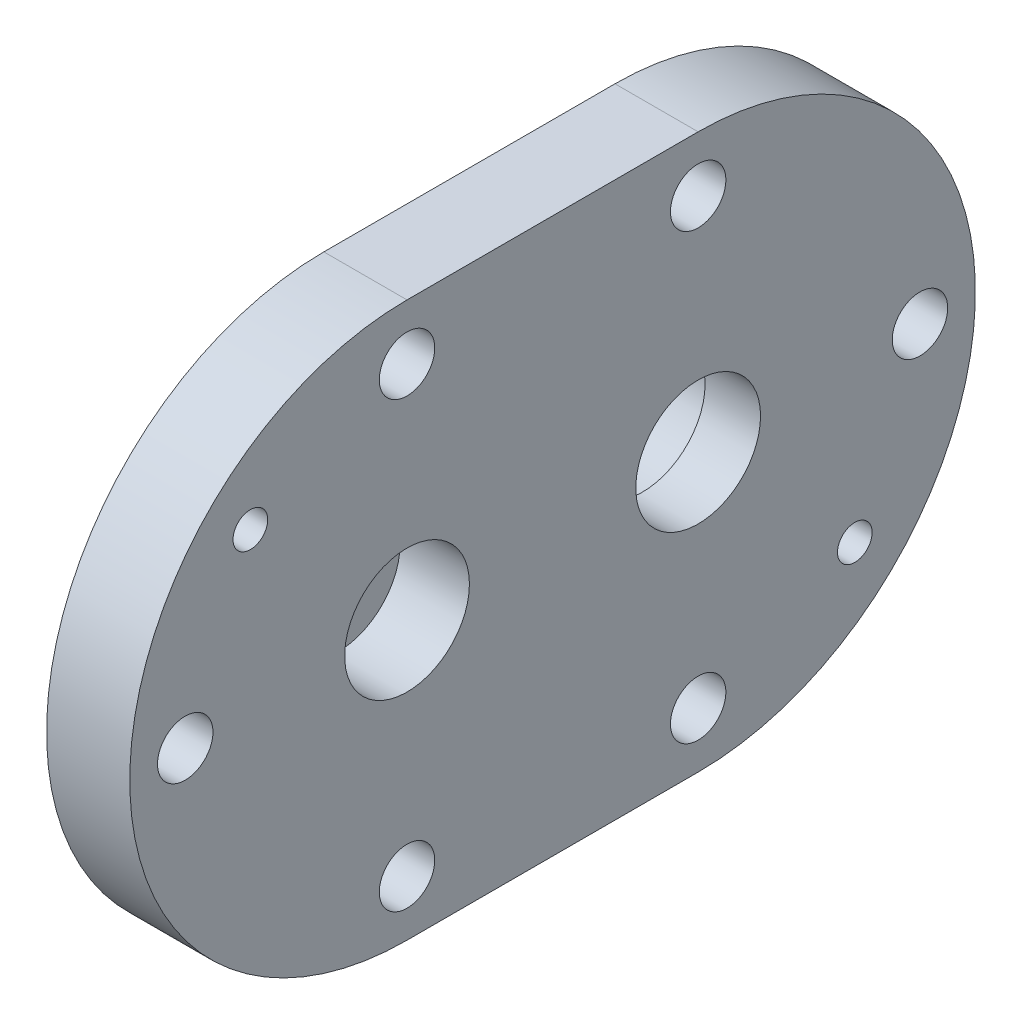
ISO-10303-21;
HEADER;
FILE_DESCRIPTION(('STEP AP214'),'2;1');
FILE_NAME('part.step','',(''),(''),'','','');
FILE_SCHEMA(('AUTOMOTIVE_DESIGN { 1 0 10303 214 1 1 1 1 }'));
ENDSEC;
DATA;
#1=APPLICATION_CONTEXT('core data for automotive mechanical design processes');
#2=APPLICATION_PROTOCOL_DEFINITION('international standard','automotive_design',2000,#1);
#3=PRODUCT_CONTEXT('',#1,'mechanical');
#4=PRODUCT('Part','Part','',(#3));
#5=PRODUCT_RELATED_PRODUCT_CATEGORY('part','',(#4));
#6=PRODUCT_DEFINITION_FORMATION('','',#4);
#7=PRODUCT_DEFINITION_CONTEXT('part definition',#1,'design');
#8=PRODUCT_DEFINITION('design','',#6,#7);
#9=PRODUCT_DEFINITION_SHAPE('','',#8);
#10=(LENGTH_UNIT() NAMED_UNIT(*) SI_UNIT(.MILLI.,.METRE.));
#11=(NAMED_UNIT(*) PLANE_ANGLE_UNIT() SI_UNIT($,.RADIAN.));
#12=(NAMED_UNIT(*) SI_UNIT($,.STERADIAN.) SOLID_ANGLE_UNIT());
#13=UNCERTAINTY_MEASURE_WITH_UNIT(LENGTH_MEASURE(1.E-05),#10,'distance_accuracy_value','');
#14=(GEOMETRIC_REPRESENTATION_CONTEXT(3) GLOBAL_UNCERTAINTY_ASSIGNED_CONTEXT((#13)) GLOBAL_UNIT_ASSIGNED_CONTEXT((#10,
#11,#12)) REPRESENTATION_CONTEXT('',''));
#15=CARTESIAN_POINT('',(0.,0.,0.));
#16=DIRECTION('',(0.,0.,1.));
#17=DIRECTION('',(1.,0.,0.));
#18=AXIS2_PLACEMENT_3D('',#15,#16,#17);
#19=CARTESIAN_POINT('',(-30.,0.,104.));
#20=DIRECTION('',(-1.,0.,0.));
#21=DIRECTION('',(0.,0.,1.));
#22=AXIS2_PLACEMENT_3D('',#19,#20,#21);
#23=CYLINDRICAL_SURFACE('',#22,40.);
#24=CARTESIAN_POINT('',(-42.,0.,104.));
#25=DIRECTION('',(1.,0.,0.));
#26=DIRECTION('',(0.,0.,-1.));
#27=AXIS2_PLACEMENT_3D('',#24,#25,#26);
#28=CIRCLE('',#27,40.);
#29=CARTESIAN_POINT('',(-42.,40.,104.));
#30=VERTEX_POINT('',#29);
#31=CARTESIAN_POINT('',(-42.,-40.,104.));
#32=VERTEX_POINT('',#31);
#33=EDGE_CURVE('E107',#30,#32,#28,.T.);
#34=ORIENTED_EDGE('',*,*,#33,.T.);
#35=DIRECTION('',(-1.,0.,0.));
#36=VECTOR('',#35,1.);
#37=CARTESIAN_POINT('',(-30.,-40.,104.));
#38=LINE('',#37,#36);
#39=CARTESIAN_POINT('',(-30.,-40.,104.));
#40=VERTEX_POINT('',#39);
#41=EDGE_CURVE('E48',#40,#32,#38,.T.);
#42=ORIENTED_EDGE('',*,*,#41,.F.);
#43=CARTESIAN_POINT('',(-30.,0.,104.));
#44=DIRECTION('',(1.,0.,0.));
#45=DIRECTION('',(0.,0.,-1.));
#46=AXIS2_PLACEMENT_3D('',#43,#44,#45);
#47=CIRCLE('',#46,40.);
#48=CARTESIAN_POINT('',(-30.,40.,104.));
#49=VERTEX_POINT('',#48);
#50=EDGE_CURVE('E93',#49,#40,#47,.T.);
#51=ORIENTED_EDGE('',*,*,#50,.F.);
#52=DIRECTION('',(-1.,0.,0.));
#53=VECTOR('',#52,1.);
#54=CARTESIAN_POINT('',(-30.,40.,104.));
#55=LINE('',#54,#53);
#56=EDGE_CURVE('E103',#49,#30,#55,.T.);
#57=ORIENTED_EDGE('',*,*,#56,.T.);
#58=EDGE_LOOP('',(#34,#42,#51,#57));
#59=FACE_BOUND('',#58,.T.);
#60=ADVANCED_FACE('F39',(#59),#23,.T.);
#61=CARTESIAN_POINT('',(-30.,-40.,104.));
#62=DIRECTION('',(0.,1.,0.));
#63=DIRECTION('',(0.,0.,1.));
#64=AXIS2_PLACEMENT_3D('',#61,#62,#63);
#65=PLANE('',#64);
#66=DIRECTION('',(0.,0.,-1.));
#67=VECTOR('',#66,1.);
#68=CARTESIAN_POINT('',(-42.,-40.,104.));
#69=LINE('',#68,#67);
#70=CARTESIAN_POINT('',(-42.,-40.,62.));
#71=VERTEX_POINT('',#70);
#72=EDGE_CURVE('E98',#32,#71,#69,.T.);
#73=ORIENTED_EDGE('',*,*,#72,.T.);
#74=DIRECTION('',(-1.,0.,0.));
#75=VECTOR('',#74,1.);
#76=CARTESIAN_POINT('',(-30.,-40.,62.));
#77=LINE('',#76,#75);
#78=CARTESIAN_POINT('',(-30.,-40.,62.));
#79=VERTEX_POINT('',#78);
#80=EDGE_CURVE('E96',#79,#71,#77,.T.);
#81=ORIENTED_EDGE('',*,*,#80,.F.);
#82=DIRECTION('',(0.,0.,-1.));
#83=VECTOR('',#82,1.);
#84=CARTESIAN_POINT('',(-30.,-40.,104.));
#85=LINE('',#84,#83);
#86=EDGE_CURVE('E88',#40,#79,#85,.T.);
#87=ORIENTED_EDGE('',*,*,#86,.F.);
#88=ORIENTED_EDGE('',*,*,#41,.T.);
#89=EDGE_LOOP('',(#73,#81,#87,#88));
#90=FACE_BOUND('',#89,.T.);
#91=ADVANCED_FACE('F97',(#90),#65,.F.);
#92=CARTESIAN_POINT('',(-30.,0.,62.));
#93=DIRECTION('',(-1.,0.,0.));
#94=DIRECTION('',(0.,0.,1.));
#95=AXIS2_PLACEMENT_3D('',#92,#93,#94);
#96=CYLINDRICAL_SURFACE('',#95,40.);
#97=CARTESIAN_POINT('',(-42.,0.,62.));
#98=DIRECTION('',(1.,0.,0.));
#99=DIRECTION('',(0.,0.,-1.));
#100=AXIS2_PLACEMENT_3D('',#97,#98,#99);
#101=CIRCLE('',#100,40.);
#102=CARTESIAN_POINT('',(-42.,40.,62.));
#103=VERTEX_POINT('',#102);
#104=EDGE_CURVE('E74',#71,#103,#101,.T.);
#105=ORIENTED_EDGE('',*,*,#104,.T.);
#106=DIRECTION('',(-1.,0.,0.));
#107=VECTOR('',#106,1.);
#108=CARTESIAN_POINT('',(-30.,40.,62.));
#109=LINE('',#108,#107);
#110=CARTESIAN_POINT('',(-30.,40.,62.));
#111=VERTEX_POINT('',#110);
#112=EDGE_CURVE('E99',#111,#103,#109,.T.);
#113=ORIENTED_EDGE('',*,*,#112,.F.);
#114=CARTESIAN_POINT('',(-30.,0.,62.));
#115=DIRECTION('',(1.,0.,0.));
#116=DIRECTION('',(0.,0.,-1.));
#117=AXIS2_PLACEMENT_3D('',#114,#115,#116);
#118=CIRCLE('',#117,40.);
#119=EDGE_CURVE('E91',#79,#111,#118,.T.);
#120=ORIENTED_EDGE('',*,*,#119,.F.);
#121=ORIENTED_EDGE('',*,*,#80,.T.);
#122=EDGE_LOOP('',(#105,#113,#120,#121));
#123=FACE_BOUND('',#122,.T.);
#124=ADVANCED_FACE('F101',(#123),#96,.T.);
#125=CARTESIAN_POINT('',(-30.,40.,62.));
#126=DIRECTION('',(0.,-1.,0.));
#127=DIRECTION('',(0.,0.,-1.));
#128=AXIS2_PLACEMENT_3D('',#125,#126,#127);
#129=PLANE('',#128);
#130=DIRECTION('',(0.,0.,1.));
#131=VECTOR('',#130,1.);
#132=CARTESIAN_POINT('',(-42.,40.,62.));
#133=LINE('',#132,#131);
#134=EDGE_CURVE('E80',#103,#30,#133,.T.);
#135=ORIENTED_EDGE('',*,*,#134,.T.);
#136=ORIENTED_EDGE('',*,*,#56,.F.);
#137=DIRECTION('',(0.,0.,1.));
#138=VECTOR('',#137,1.);
#139=CARTESIAN_POINT('',(-30.,40.,62.));
#140=LINE('',#139,#138);
#141=EDGE_CURVE('E57',#111,#49,#140,.T.);
#142=ORIENTED_EDGE('',*,*,#141,.F.);
#143=ORIENTED_EDGE('',*,*,#112,.T.);
#144=EDGE_LOOP('',(#135,#136,#142,#143));
#145=FACE_BOUND('',#144,.T.);
#146=ADVANCED_FACE('F222',(#145),#129,.F.);
#147=CARTESIAN_POINT('',(-30.,0.,104.));
#148=DIRECTION('',(1.,0.,0.));
#149=DIRECTION('',(0.,0.,-1.));
#150=AXIS2_PLACEMENT_3D('',#147,#148,#149);
#151=PLANE('',#150);
#152=CARTESIAN_POINT('',(-30.,-22.6,39.4));
#153=DIRECTION('',(1.,0.,0.));
#154=DIRECTION('',(0.,0.,-1.));
#155=AXIS2_PLACEMENT_3D('',#152,#153,#154);
#156=CIRCLE('',#155,2.5);
#157=CARTESIAN_POINT('',(-30.,-22.6,36.9));
#158=VERTEX_POINT('',#157);
#159=EDGE_CURVE('E148',#158,#158,#156,.F.);
#160=ORIENTED_EDGE('',*,*,#159,.T.);
#161=EDGE_LOOP('',(#160));
#162=FACE_BOUND('',#161,.T.);
#163=CARTESIAN_POINT('',(-30.,22.6,126.6));
#164=DIRECTION('',(1.,0.,0.));
#165=DIRECTION('',(0.,0.,-1.));
#166=AXIS2_PLACEMENT_3D('',#163,#164,#165);
#167=CIRCLE('',#166,2.5);
#168=CARTESIAN_POINT('',(-30.,22.6,124.1));
#169=VERTEX_POINT('',#168);
#170=EDGE_CURVE('E145',#169,#169,#167,.F.);
#171=ORIENTED_EDGE('',*,*,#170,.T.);
#172=EDGE_LOOP('',(#171));
#173=FACE_BOUND('',#172,.T.);
#174=CARTESIAN_POINT('',(-30.,0.,30.));
#175=DIRECTION('',(1.,0.,0.));
#176=DIRECTION('',(0.,0.,-1.));
#177=AXIS2_PLACEMENT_3D('',#174,#175,#176);
#178=CIRCLE('',#177,4.);
#179=CARTESIAN_POINT('',(-30.,0.,26.));
#180=VERTEX_POINT('',#179);
#181=EDGE_CURVE('E142',#180,#180,#178,.F.);
#182=ORIENTED_EDGE('',*,*,#181,.T.);
#183=EDGE_LOOP('',(#182));
#184=FACE_BOUND('',#183,.T.);
#185=CARTESIAN_POINT('',(-30.,0.,136.));
#186=DIRECTION('',(1.,0.,0.));
#187=DIRECTION('',(0.,0.,-1.));
#188=AXIS2_PLACEMENT_3D('',#185,#186,#187);
#189=CIRCLE('',#188,4.);
#190=CARTESIAN_POINT('',(-30.,0.,132.));
#191=VERTEX_POINT('',#190);
#192=EDGE_CURVE('E138',#191,#191,#189,.F.);
#193=ORIENTED_EDGE('',*,*,#192,.T.);
#194=EDGE_LOOP('',(#193));
#195=FACE_BOUND('',#194,.T.);
#196=CARTESIAN_POINT('',(-30.,-32.,62.));
#197=DIRECTION('',(1.,0.,0.));
#198=DIRECTION('',(0.,0.,-1.));
#199=AXIS2_PLACEMENT_3D('',#196,#197,#198);
#200=CIRCLE('',#199,4.);
#201=CARTESIAN_POINT('',(-30.,-32.,58.));
#202=VERTEX_POINT('',#201);
#203=EDGE_CURVE('E134',#202,#202,#200,.F.);
#204=ORIENTED_EDGE('',*,*,#203,.T.);
#205=EDGE_LOOP('',(#204));
#206=FACE_BOUND('',#205,.T.);
#207=CARTESIAN_POINT('',(-30.,32.,62.));
#208=DIRECTION('',(1.,0.,0.));
#209=DIRECTION('',(0.,0.,-1.));
#210=AXIS2_PLACEMENT_3D('',#207,#208,#209);
#211=CIRCLE('',#210,4.);
#212=CARTESIAN_POINT('',(-30.,32.,58.));
#213=VERTEX_POINT('',#212);
#214=EDGE_CURVE('E130',#213,#213,#211,.F.);
#215=ORIENTED_EDGE('',*,*,#214,.T.);
#216=EDGE_LOOP('',(#215));
#217=FACE_BOUND('',#216,.T.);
#218=CARTESIAN_POINT('',(-30.,-32.,104.));
#219=DIRECTION('',(1.,0.,0.));
#220=DIRECTION('',(0.,0.,-1.));
#221=AXIS2_PLACEMENT_3D('',#218,#219,#220);
#222=CIRCLE('',#221,4.);
#223=CARTESIAN_POINT('',(-30.,-32.,100.));
#224=VERTEX_POINT('',#223);
#225=EDGE_CURVE('E126',#224,#224,#222,.F.);
#226=ORIENTED_EDGE('',*,*,#225,.T.);
#227=EDGE_LOOP('',(#226));
#228=FACE_BOUND('',#227,.T.);
#229=CARTESIAN_POINT('',(-30.,32.,104.));
#230=DIRECTION('',(1.,0.,0.));
#231=DIRECTION('',(0.,0.,-1.));
#232=AXIS2_PLACEMENT_3D('',#229,#230,#231);
#233=CIRCLE('',#232,4.);
#234=CARTESIAN_POINT('',(-30.,32.,100.));
#235=VERTEX_POINT('',#234);
#236=EDGE_CURVE('E125',#235,#235,#233,.F.);
#237=ORIENTED_EDGE('',*,*,#236,.T.);
#238=EDGE_LOOP('',(#237));
#239=FACE_BOUND('',#238,.T.);
#240=CARTESIAN_POINT('',(-30.,0.,62.));
#241=DIRECTION('',(1.,0.,0.));
#242=DIRECTION('',(0.,0.,-1.));
#243=AXIS2_PLACEMENT_3D('',#240,#241,#242);
#244=CIRCLE('',#243,9.);
#245=CARTESIAN_POINT('',(-30.,0.,53.));
#246=VERTEX_POINT('',#245);
#247=EDGE_CURVE('E120',#246,#246,#244,.T.);
#248=ORIENTED_EDGE('',*,*,#247,.F.);
#249=EDGE_LOOP('',(#248));
#250=FACE_BOUND('',#249,.T.);
#251=CARTESIAN_POINT('',(-30.,0.,104.));
#252=DIRECTION('',(1.,0.,0.));
#253=DIRECTION('',(0.,0.,-1.));
#254=AXIS2_PLACEMENT_3D('',#251,#252,#253);
#255=CIRCLE('',#254,8.99999999999999);
#256=CARTESIAN_POINT('',(-30.,0.,95.));
#257=VERTEX_POINT('',#256);
#258=EDGE_CURVE('E178',#257,#257,#255,.T.);
#259=ORIENTED_EDGE('',*,*,#258,.F.);
#260=EDGE_LOOP('',(#259));
#261=FACE_BOUND('',#260,.T.);
#262=ORIENTED_EDGE('',*,*,#50,.T.);
#263=ORIENTED_EDGE('',*,*,#86,.T.);
#264=ORIENTED_EDGE('',*,*,#119,.T.);
#265=ORIENTED_EDGE('',*,*,#141,.T.);
#266=EDGE_LOOP('',(#262,#263,#264,#265));
#267=FACE_BOUND('',#266,.T.);
#268=ADVANCED_FACE('F89',(#162,#173,#184,#195,#206,#217,#228,#239,#250,#261,#267),#151,.T.);
#269=CARTESIAN_POINT('',(-42.,0.,104.));
#270=DIRECTION('',(1.,0.,0.));
#271=DIRECTION('',(0.,0.,-1.));
#272=AXIS2_PLACEMENT_3D('',#269,#270,#271);
#273=PLANE('',#272);
#274=CARTESIAN_POINT('',(-42.,-22.6,39.4));
#275=DIRECTION('',(1.,0.,0.));
#276=DIRECTION('',(0.,0.,-1.));
#277=AXIS2_PLACEMENT_3D('',#274,#275,#276);
#278=CIRCLE('',#277,2.5);
#279=CARTESIAN_POINT('',(-42.,-22.6,36.9));
#280=VERTEX_POINT('',#279);
#281=EDGE_CURVE('E42',#280,#280,#278,.F.);
#282=ORIENTED_EDGE('',*,*,#281,.F.);
#283=EDGE_LOOP('',(#282));
#284=FACE_BOUND('',#283,.T.);
#285=CARTESIAN_POINT('',(-42.,22.6,126.6));
#286=DIRECTION('',(1.,0.,0.));
#287=DIRECTION('',(0.,0.,-1.));
#288=AXIS2_PLACEMENT_3D('',#285,#286,#287);
#289=CIRCLE('',#288,2.5);
#290=CARTESIAN_POINT('',(-42.,22.6,124.1));
#291=VERTEX_POINT('',#290);
#292=EDGE_CURVE('E146',#291,#291,#289,.F.);
#293=ORIENTED_EDGE('',*,*,#292,.F.);
#294=EDGE_LOOP('',(#293));
#295=FACE_BOUND('',#294,.T.);
#296=CARTESIAN_POINT('',(-42.,0.,30.));
#297=DIRECTION('',(1.,0.,0.));
#298=DIRECTION('',(0.,0.,-1.));
#299=AXIS2_PLACEMENT_3D('',#296,#297,#298);
#300=CIRCLE('',#299,4.);
#301=CARTESIAN_POINT('',(-42.,0.,26.));
#302=VERTEX_POINT('',#301);
#303=EDGE_CURVE('E143',#302,#302,#300,.F.);
#304=ORIENTED_EDGE('',*,*,#303,.F.);
#305=EDGE_LOOP('',(#304));
#306=FACE_BOUND('',#305,.T.);
#307=CARTESIAN_POINT('',(-42.,0.,136.));
#308=DIRECTION('',(1.,0.,0.));
#309=DIRECTION('',(0.,0.,-1.));
#310=AXIS2_PLACEMENT_3D('',#307,#308,#309);
#311=CIRCLE('',#310,4.);
#312=CARTESIAN_POINT('',(-42.,0.,132.));
#313=VERTEX_POINT('',#312);
#314=EDGE_CURVE('E139',#313,#313,#311,.F.);
#315=ORIENTED_EDGE('',*,*,#314,.F.);
#316=EDGE_LOOP('',(#315));
#317=FACE_BOUND('',#316,.T.);
#318=CARTESIAN_POINT('',(-42.,-32.,62.));
#319=DIRECTION('',(1.,0.,0.));
#320=DIRECTION('',(0.,0.,-1.));
#321=AXIS2_PLACEMENT_3D('',#318,#319,#320);
#322=CIRCLE('',#321,4.);
#323=CARTESIAN_POINT('',(-42.,-32.,58.));
#324=VERTEX_POINT('',#323);
#325=EDGE_CURVE('E135',#324,#324,#322,.F.);
#326=ORIENTED_EDGE('',*,*,#325,.F.);
#327=EDGE_LOOP('',(#326));
#328=FACE_BOUND('',#327,.T.);
#329=CARTESIAN_POINT('',(-42.,32.,62.));
#330=DIRECTION('',(1.,0.,0.));
#331=DIRECTION('',(0.,0.,-1.));
#332=AXIS2_PLACEMENT_3D('',#329,#330,#331);
#333=CIRCLE('',#332,4.);
#334=CARTESIAN_POINT('',(-42.,32.,58.));
#335=VERTEX_POINT('',#334);
#336=EDGE_CURVE('E131',#335,#335,#333,.F.);
#337=ORIENTED_EDGE('',*,*,#336,.F.);
#338=EDGE_LOOP('',(#337));
#339=FACE_BOUND('',#338,.T.);
#340=CARTESIAN_POINT('',(-42.,-32.,104.));
#341=DIRECTION('',(1.,0.,0.));
#342=DIRECTION('',(0.,0.,-1.));
#343=AXIS2_PLACEMENT_3D('',#340,#341,#342);
#344=CIRCLE('',#343,4.);
#345=CARTESIAN_POINT('',(-42.,-32.,100.));
#346=VERTEX_POINT('',#345);
#347=EDGE_CURVE('E127',#346,#346,#344,.F.);
#348=ORIENTED_EDGE('',*,*,#347,.F.);
#349=EDGE_LOOP('',(#348));
#350=FACE_BOUND('',#349,.T.);
#351=CARTESIAN_POINT('',(-42.,32.,104.));
#352=DIRECTION('',(1.,0.,0.));
#353=DIRECTION('',(0.,0.,-1.));
#354=AXIS2_PLACEMENT_3D('',#351,#352,#353);
#355=CIRCLE('',#354,4.);
#356=CARTESIAN_POINT('',(-42.,32.,100.));
#357=VERTEX_POINT('',#356);
#358=EDGE_CURVE('E122',#357,#357,#355,.F.);
#359=ORIENTED_EDGE('',*,*,#358,.F.);
#360=EDGE_LOOP('',(#359));
#361=FACE_BOUND('',#360,.T.);
#362=CARTESIAN_POINT('',(-42.,0.,62.));
#363=DIRECTION('',(1.,0.,0.));
#364=DIRECTION('',(0.,0.,-1.));
#365=AXIS2_PLACEMENT_3D('',#362,#363,#364);
#366=CIRCLE('',#365,16.);
#367=CARTESIAN_POINT('',(-42.,0.,46.));
#368=VERTEX_POINT('',#367);
#369=EDGE_CURVE('E11',#368,#368,#366,.F.);
#370=ORIENTED_EDGE('',*,*,#369,.F.);
#371=EDGE_LOOP('',(#370));
#372=FACE_BOUND('',#371,.T.);
#373=CARTESIAN_POINT('',(-42.,0.,104.));
#374=DIRECTION('',(1.,0.,0.));
#375=DIRECTION('',(0.,0.,-1.));
#376=AXIS2_PLACEMENT_3D('',#373,#374,#375);
#377=CIRCLE('',#376,16.);
#378=CARTESIAN_POINT('',(-42.,0.,88.));
#379=VERTEX_POINT('',#378);
#380=EDGE_CURVE('E110',#379,#379,#377,.T.);
#381=ORIENTED_EDGE('',*,*,#380,.T.);
#382=EDGE_LOOP('',(#381));
#383=FACE_BOUND('',#382,.T.);
#384=ORIENTED_EDGE('',*,*,#33,.F.);
#385=ORIENTED_EDGE('',*,*,#134,.F.);
#386=ORIENTED_EDGE('',*,*,#104,.F.);
#387=ORIENTED_EDGE('',*,*,#72,.F.);
#388=EDGE_LOOP('',(#384,#385,#386,#387));
#389=FACE_BOUND('',#388,.T.);
#390=ADVANCED_FACE('F206',(#284,#295,#306,#317,#328,#339,#350,#361,#372,#383,#389),#273,.F.);
#391=CARTESIAN_POINT('',(-42.,0.,104.));
#392=DIRECTION('',(-1.,0.,0.));
#393=DIRECTION('',(0.,0.,1.));
#394=AXIS2_PLACEMENT_3D('',#391,#392,#393);
#395=CYLINDRICAL_SURFACE('',#394,16.);
#396=ORIENTED_EDGE('',*,*,#380,.F.);
#397=EDGE_LOOP('',(#396));
#398=FACE_BOUND('',#397,.T.);
#399=CARTESIAN_POINT('',(-52.,0.,104.));
#400=DIRECTION('',(1.,0.,0.));
#401=DIRECTION('',(0.,0.,-1.));
#402=AXIS2_PLACEMENT_3D('',#399,#400,#401);
#403=CIRCLE('',#402,16.);
#404=CARTESIAN_POINT('',(-52.,0.,88.));
#405=VERTEX_POINT('',#404);
#406=EDGE_CURVE('E187',#405,#405,#403,.T.);
#407=ORIENTED_EDGE('',*,*,#406,.T.);
#408=EDGE_LOOP('',(#407));
#409=FACE_BOUND('',#408,.T.);
#410=ADVANCED_FACE('F193',(#398,#409),#395,.T.);
#411=CARTESIAN_POINT('',(-52.,0.,104.));
#412=DIRECTION('',(1.,0.,0.));
#413=DIRECTION('',(0.,0.,-1.));
#414=AXIS2_PLACEMENT_3D('',#411,#412,#413);
#415=PLANE('',#414);
#416=ORIENTED_EDGE('',*,*,#406,.F.);
#417=EDGE_LOOP('',(#416));
#418=FACE_BOUND('',#417,.T.);
#419=ADVANCED_FACE('F195',(#418),#415,.F.);
#420=CARTESIAN_POINT('',(-42.,0.,62.));
#421=DIRECTION('',(-1.,0.,0.));
#422=DIRECTION('',(0.,0.,1.));
#423=AXIS2_PLACEMENT_3D('',#420,#421,#422);
#424=CYLINDRICAL_SURFACE('',#423,16.);
#425=ORIENTED_EDGE('',*,*,#369,.T.);
#426=EDGE_LOOP('',(#425));
#427=FACE_BOUND('',#426,.T.);
#428=CARTESIAN_POINT('',(-64.,0.,62.));
#429=DIRECTION('',(1.,0.,0.));
#430=DIRECTION('',(0.,0.,-1.));
#431=AXIS2_PLACEMENT_3D('',#428,#429,#430);
#432=CIRCLE('',#431,16.);
#433=CARTESIAN_POINT('',(-64.,0.,46.));
#434=VERTEX_POINT('',#433);
#435=EDGE_CURVE('E182',#434,#434,#432,.T.);
#436=ORIENTED_EDGE('',*,*,#435,.T.);
#437=EDGE_LOOP('',(#436));
#438=FACE_BOUND('',#437,.T.);
#439=ADVANCED_FACE('F197',(#427,#438),#424,.T.);
#440=CARTESIAN_POINT('',(-64.,0.,62.));
#441=DIRECTION('',(1.,0.,0.));
#442=DIRECTION('',(0.,0.,-1.));
#443=AXIS2_PLACEMENT_3D('',#440,#441,#442);
#444=PLANE('',#443);
#445=CARTESIAN_POINT('',(-64.,0.,62.));
#446=DIRECTION('',(1.,0.,0.));
#447=DIRECTION('',(0.,0.,-1.));
#448=AXIS2_PLACEMENT_3D('',#445,#446,#447);
#449=CIRCLE('',#448,10.);
#450=CARTESIAN_POINT('',(-64.,0.,72.));
#451=VERTEX_POINT('',#450);
#452=EDGE_CURVE('E171',#451,#451,#449,.T.);
#453=ORIENTED_EDGE('',*,*,#452,.T.);
#454=EDGE_LOOP('',(#453));
#455=FACE_BOUND('',#454,.T.);
#456=ORIENTED_EDGE('',*,*,#435,.F.);
#457=EDGE_LOOP('',(#456));
#458=FACE_BOUND('',#457,.T.);
#459=ADVANCED_FACE('F203',(#455,#458),#444,.F.);
#460=CARTESIAN_POINT('',(-40.,0.,104.));
#461=DIRECTION('',(1.,0.,0.));
#462=DIRECTION('',(0.,0.,-1.));
#463=AXIS2_PLACEMENT_3D('',#460,#461,#462);
#464=CYLINDRICAL_SURFACE('',#463,8.99999999999999);
#465=CARTESIAN_POINT('',(-40.,0.,104.));
#466=DIRECTION('',(1.,0.,0.));
#467=DIRECTION('',(0.,0.,-1.));
#468=AXIS2_PLACEMENT_3D('',#465,#466,#467);
#469=CIRCLE('',#468,8.99999999999999);
#470=CARTESIAN_POINT('',(-40.,0.,95.));
#471=VERTEX_POINT('',#470);
#472=EDGE_CURVE('E179',#471,#471,#469,.T.);
#473=ORIENTED_EDGE('',*,*,#472,.F.);
#474=EDGE_LOOP('',(#473));
#475=FACE_BOUND('',#474,.T.);
#476=ORIENTED_EDGE('',*,*,#258,.T.);
#477=EDGE_LOOP('',(#476));
#478=FACE_BOUND('',#477,.T.);
#479=ADVANCED_FACE('F351',(#475,#478),#464,.F.);
#480=CARTESIAN_POINT('',(-40.,0.,104.));
#481=DIRECTION('',(1.,0.,0.));
#482=DIRECTION('',(0.,0.,-1.));
#483=AXIS2_PLACEMENT_3D('',#480,#481,#482);
#484=PLANE('',#483);
#485=ORIENTED_EDGE('',*,*,#472,.T.);
#486=EDGE_LOOP('',(#485));
#487=FACE_BOUND('',#486,.T.);
#488=ADVANCED_FACE('F342',(#487),#484,.T.);
#489=CARTESIAN_POINT('',(-40.,0.,62.));
#490=DIRECTION('',(1.,0.,0.));
#491=DIRECTION('',(0.,0.,-1.));
#492=AXIS2_PLACEMENT_3D('',#489,#490,#491);
#493=CYLINDRICAL_SURFACE('',#492,9.);
#494=CARTESIAN_POINT('',(-38.,0.,62.));
#495=DIRECTION('',(1.,0.,0.));
#496=DIRECTION('',(0.,0.,-1.));
#497=AXIS2_PLACEMENT_3D('',#494,#495,#496);
#498=CIRCLE('',#497,9.);
#499=CARTESIAN_POINT('',(-38.,0.,53.));
#500=VERTEX_POINT('',#499);
#501=EDGE_CURVE('E117',#500,#500,#498,.F.);
#502=ORIENTED_EDGE('',*,*,#501,.T.);
#503=EDGE_LOOP('',(#502));
#504=FACE_BOUND('',#503,.T.);
#505=ORIENTED_EDGE('',*,*,#247,.T.);
#506=EDGE_LOOP('',(#505));
#507=FACE_BOUND('',#506,.T.);
#508=ADVANCED_FACE('F334',(#504,#507),#493,.F.);
#509=CARTESIAN_POINT('',(-38.,0.,62.));
#510=DIRECTION('',(1.,0.,0.));
#511=DIRECTION('',(0.,0.,-1.));
#512=AXIS2_PLACEMENT_3D('',#509,#510,#511);
#513=PLANE('',#512);
#514=CARTESIAN_POINT('',(-38.,0.,62.));
#515=DIRECTION('',(1.,0.,0.));
#516=DIRECTION('',(0.,0.,-1.));
#517=AXIS2_PLACEMENT_3D('',#514,#515,#516);
#518=CIRCLE('',#517,10.);
#519=CARTESIAN_POINT('',(-38.,0.,72.));
#520=VERTEX_POINT('',#519);
#521=EDGE_CURVE('E121',#520,#520,#518,.T.);
#522=ORIENTED_EDGE('',*,*,#521,.F.);
#523=EDGE_LOOP('',(#522));
#524=FACE_BOUND('',#523,.T.);
#525=ORIENTED_EDGE('',*,*,#501,.F.);
#526=EDGE_LOOP('',(#525));
#527=FACE_BOUND('',#526,.T.);
#528=ADVANCED_FACE('F326',(#524,#527),#513,.F.);
#529=CARTESIAN_POINT('',(-38.,0.,62.));
#530=DIRECTION('',(-1.,0.,0.));
#531=DIRECTION('',(0.,0.,1.));
#532=AXIS2_PLACEMENT_3D('',#529,#530,#531);
#533=CYLINDRICAL_SURFACE('',#532,10.);
#534=CARTESIAN_POINT('',(-38.,0.,72.));
#535=CARTESIAN_POINT('',(-38.2708333333333,0.,72.));
#536=CARTESIAN_POINT('',(-38.5416666666667,0.,72.));
#537=CARTESIAN_POINT('',(-39.0833333333333,0.,72.));
#538=CARTESIAN_POINT('',(-39.3541666666667,0.,72.));
#539=CARTESIAN_POINT('',(-39.8958333333333,0.,72.));
#540=CARTESIAN_POINT('',(-40.1666666666667,0.,72.));
#541=CARTESIAN_POINT('',(-40.7083333333333,0.,72.));
#542=CARTESIAN_POINT('',(-40.9791666666667,0.,72.));
#543=CARTESIAN_POINT('',(-41.5208333333333,0.,72.));
#544=CARTESIAN_POINT('',(-41.7916666666667,0.,72.));
#545=CARTESIAN_POINT('',(-42.3333333333333,0.,72.));
#546=CARTESIAN_POINT('',(-42.6041666666667,0.,72.));
#547=CARTESIAN_POINT('',(-43.1458333333333,0.,72.));
#548=CARTESIAN_POINT('',(-43.4166666666667,0.,72.));
#549=CARTESIAN_POINT('',(-43.9583333333333,0.,72.));
#550=CARTESIAN_POINT('',(-44.2291666666667,0.,72.));
#551=CARTESIAN_POINT('',(-44.7708333333333,0.,72.));
#552=CARTESIAN_POINT('',(-45.0416666666667,0.,72.));
#553=CARTESIAN_POINT('',(-45.5833333333333,0.,72.));
#554=CARTESIAN_POINT('',(-45.8541666666667,0.,72.));
#555=CARTESIAN_POINT('',(-46.3958333333333,0.,72.));
#556=CARTESIAN_POINT('',(-46.6666666666667,0.,72.));
#557=CARTESIAN_POINT('',(-47.2083333333333,0.,72.));
#558=CARTESIAN_POINT('',(-47.4791666666667,0.,72.));
#559=CARTESIAN_POINT('',(-48.0208333333333,0.,72.));
#560=CARTESIAN_POINT('',(-48.2916666666667,0.,72.));
#561=CARTESIAN_POINT('',(-48.8333333333333,0.,72.));
#562=CARTESIAN_POINT('',(-49.1041666666667,0.,72.));
#563=CARTESIAN_POINT('',(-49.6458333333333,0.,72.));
#564=CARTESIAN_POINT('',(-49.9166666666667,0.,72.));
#565=CARTESIAN_POINT('',(-50.4583333333333,0.,72.));
#566=CARTESIAN_POINT('',(-50.7291666666667,0.,72.));
#567=CARTESIAN_POINT('',(-51.2708333333333,0.,72.));
#568=CARTESIAN_POINT('',(-51.5416666666667,0.,72.));
#569=CARTESIAN_POINT('',(-52.0833333333333,0.,72.));
#570=CARTESIAN_POINT('',(-52.3541666666667,0.,72.));
#571=CARTESIAN_POINT('',(-52.8958333333333,0.,72.));
#572=CARTESIAN_POINT('',(-53.1666666666667,0.,72.));
#573=CARTESIAN_POINT('',(-53.7083333333333,0.,72.));
#574=CARTESIAN_POINT('',(-53.9791666666667,0.,72.));
#575=CARTESIAN_POINT('',(-54.5208333333333,0.,72.));
#576=CARTESIAN_POINT('',(-54.7916666666667,0.,72.));
#577=CARTESIAN_POINT('',(-55.3333333333333,0.,72.));
#578=CARTESIAN_POINT('',(-55.6041666666667,0.,72.));
#579=CARTESIAN_POINT('',(-56.1458333333333,0.,72.));
#580=CARTESIAN_POINT('',(-56.4166666666667,0.,72.));
#581=CARTESIAN_POINT('',(-56.9583333333333,0.,72.));
#582=CARTESIAN_POINT('',(-57.2291666666667,0.,72.));
#583=CARTESIAN_POINT('',(-57.7708333333333,0.,72.));
#584=CARTESIAN_POINT('',(-58.0416666666667,0.,72.));
#585=CARTESIAN_POINT('',(-58.5833333333333,0.,72.));
#586=CARTESIAN_POINT('',(-58.8541666666667,0.,72.));
#587=CARTESIAN_POINT('',(-59.3958333333333,0.,72.));
#588=CARTESIAN_POINT('',(-59.6666666666667,0.,72.));
#589=CARTESIAN_POINT('',(-60.2083333333333,0.,72.));
#590=CARTESIAN_POINT('',(-60.4791666666667,0.,72.));
#591=CARTESIAN_POINT('',(-61.0208333333333,0.,72.));
#592=CARTESIAN_POINT('',(-61.2916666666667,0.,72.));
#593=CARTESIAN_POINT('',(-61.8333333333333,0.,72.));
#594=CARTESIAN_POINT('',(-62.1041666666667,0.,72.));
#595=CARTESIAN_POINT('',(-62.6458333333333,0.,72.));
#596=CARTESIAN_POINT('',(-62.9166666666667,0.,72.));
#597=CARTESIAN_POINT('',(-63.4583333333333,0.,72.));
#598=CARTESIAN_POINT('',(-63.7291666666667,0.,72.));
#599=CARTESIAN_POINT('',(-64.,0.,72.));
#600=B_SPLINE_CURVE_WITH_KNOTS('',3,(#534,#535,#536,#537,#538,#539,#540,#541,#542,#543,#544,
#545,#546,#547,#548,#549,#550,#551,#552,#553,#554,#555,#556,#557,#558,#559,#560,#561,#562,#563,
#564,#565,#566,#567,#568,#569,#570,#571,#572,#573,#574,#575,#576,#577,#578,#579,#580,#581,#582,
#583,#584,#585,#586,#587,#588,#589,#590,#591,#592,#593,#594,#595,#596,#597,#598,#599),
.UNSPECIFIED.,.F.,.F.,(4,2,2,2,2,2,2,2,2,2,2,2,2,2,2,2,2,2,2,2,2,2,2,2,2,2,2,2,2,2,2,2,4),(0.,
0.812500000000001,1.625,2.4375,3.25,4.0625,4.875,5.68750000000001,6.50000000000001,
7.31250000000001,8.12500000000001,8.9375,9.75,10.5625,11.375,12.1875,13.,13.8125,14.625,15.4375,
16.25,17.0625,17.875,18.6875,19.5,20.3125,21.125,21.9375,22.75,23.5625,24.375,25.1875,26.),.UNSPECIFIED.);
#601=EDGE_CURVE('BSEAM318',#520,#451,#600,.T.);
#602=ORIENTED_EDGE('',*,*,#521,.T.);
#603=ORIENTED_EDGE('',*,*,#452,.F.);
#604=ORIENTED_EDGE('',*,*,#601,.T.);
#605=ORIENTED_EDGE('',*,*,#601,.F.);
#606=EDGE_LOOP('',(#602,#604,#603,#605));
#607=FACE_BOUND('',#606,.T.);
#608=ADVANCED_FACE('F318',(#607),#533,.F.);
#609=CARTESIAN_POINT('',(-29.,32.,104.));
#610=DIRECTION('',(-1.,0.,0.));
#611=DIRECTION('',(0.,0.,1.));
#612=AXIS2_PLACEMENT_3D('',#609,#610,#611);
#613=CYLINDRICAL_SURFACE('',#612,4.);
#614=ORIENTED_EDGE('',*,*,#236,.F.);
#615=EDGE_LOOP('',(#614));
#616=FACE_BOUND('',#615,.T.);
#617=ORIENTED_EDGE('',*,*,#358,.T.);
#618=EDGE_LOOP('',(#617));
#619=FACE_BOUND('',#618,.T.);
#620=ADVANCED_FACE('F310',(#616,#619),#613,.F.);
#621=CARTESIAN_POINT('',(-29.,-32.,104.));
#622=DIRECTION('',(-1.,0.,0.));
#623=DIRECTION('',(0.,0.,1.));
#624=AXIS2_PLACEMENT_3D('',#621,#622,#623);
#625=CYLINDRICAL_SURFACE('',#624,4.);
#626=ORIENTED_EDGE('',*,*,#225,.F.);
#627=EDGE_LOOP('',(#626));
#628=FACE_BOUND('',#627,.T.);
#629=ORIENTED_EDGE('',*,*,#347,.T.);
#630=EDGE_LOOP('',(#629));
#631=FACE_BOUND('',#630,.T.);
#632=ADVANCED_FACE('F302',(#628,#631),#625,.F.);
#633=CARTESIAN_POINT('',(-29.,32.,62.));
#634=DIRECTION('',(-1.,0.,0.));
#635=DIRECTION('',(0.,0.,1.));
#636=AXIS2_PLACEMENT_3D('',#633,#634,#635);
#637=CYLINDRICAL_SURFACE('',#636,4.);
#638=ORIENTED_EDGE('',*,*,#214,.F.);
#639=EDGE_LOOP('',(#638));
#640=FACE_BOUND('',#639,.T.);
#641=ORIENTED_EDGE('',*,*,#336,.T.);
#642=EDGE_LOOP('',(#641));
#643=FACE_BOUND('',#642,.T.);
#644=ADVANCED_FACE('F294',(#640,#643),#637,.F.);
#645=CARTESIAN_POINT('',(-29.,-32.,62.));
#646=DIRECTION('',(-1.,0.,0.));
#647=DIRECTION('',(0.,0.,1.));
#648=AXIS2_PLACEMENT_3D('',#645,#646,#647);
#649=CYLINDRICAL_SURFACE('',#648,4.);
#650=ORIENTED_EDGE('',*,*,#203,.F.);
#651=EDGE_LOOP('',(#650));
#652=FACE_BOUND('',#651,.T.);
#653=ORIENTED_EDGE('',*,*,#325,.T.);
#654=EDGE_LOOP('',(#653));
#655=FACE_BOUND('',#654,.T.);
#656=ADVANCED_FACE('F286',(#652,#655),#649,.F.);
#657=CARTESIAN_POINT('',(-29.,0.,136.));
#658=DIRECTION('',(-1.,0.,0.));
#659=DIRECTION('',(0.,0.,1.));
#660=AXIS2_PLACEMENT_3D('',#657,#658,#659);
#661=CYLINDRICAL_SURFACE('',#660,4.);
#662=ORIENTED_EDGE('',*,*,#192,.F.);
#663=EDGE_LOOP('',(#662));
#664=FACE_BOUND('',#663,.T.);
#665=ORIENTED_EDGE('',*,*,#314,.T.);
#666=EDGE_LOOP('',(#665));
#667=FACE_BOUND('',#666,.T.);
#668=ADVANCED_FACE('F278',(#664,#667),#661,.F.);
#669=CARTESIAN_POINT('',(-29.,0.,30.));
#670=DIRECTION('',(-1.,0.,0.));
#671=DIRECTION('',(0.,0.,1.));
#672=AXIS2_PLACEMENT_3D('',#669,#670,#671);
#673=CYLINDRICAL_SURFACE('',#672,4.);
#674=ORIENTED_EDGE('',*,*,#181,.F.);
#675=EDGE_LOOP('',(#674));
#676=FACE_BOUND('',#675,.T.);
#677=ORIENTED_EDGE('',*,*,#303,.T.);
#678=EDGE_LOOP('',(#677));
#679=FACE_BOUND('',#678,.T.);
#680=ADVANCED_FACE('F273',(#676,#679),#673,.F.);
#681=CARTESIAN_POINT('',(-29.,22.6,126.6));
#682=DIRECTION('',(-1.,0.,0.));
#683=DIRECTION('',(0.,0.,1.));
#684=AXIS2_PLACEMENT_3D('',#681,#682,#683);
#685=CYLINDRICAL_SURFACE('',#684,2.5);
#686=ORIENTED_EDGE('',*,*,#170,.F.);
#687=EDGE_LOOP('',(#686));
#688=FACE_BOUND('',#687,.T.);
#689=ORIENTED_EDGE('',*,*,#292,.T.);
#690=EDGE_LOOP('',(#689));
#691=FACE_BOUND('',#690,.T.);
#692=ADVANCED_FACE('F250',(#688,#691),#685,.F.);
#693=CARTESIAN_POINT('',(-29.,-22.6,39.4));
#694=DIRECTION('',(-1.,0.,0.));
#695=DIRECTION('',(0.,0.,1.));
#696=AXIS2_PLACEMENT_3D('',#693,#694,#695);
#697=CYLINDRICAL_SURFACE('',#696,2.5);
#698=ORIENTED_EDGE('',*,*,#159,.F.);
#699=EDGE_LOOP('',(#698));
#700=FACE_BOUND('',#699,.T.);
#701=ORIENTED_EDGE('',*,*,#281,.T.);
#702=EDGE_LOOP('',(#701));
#703=FACE_BOUND('',#702,.T.);
#704=ADVANCED_FACE('F261',(#700,#703),#697,.F.);
#705=CLOSED_SHELL('',(#60,#91,#124,#146,#268,#390,#410,#419,#439,#459,#479,#488,#508,#528,#608,
#620,#632,#644,#656,#668,#680,#692,#704));
#706=MANIFOLD_SOLID_BREP('B2',#705);
#707=ADVANCED_BREP_SHAPE_REPRESENTATION('',(#18,#706),#14);
#708=SHAPE_DEFINITION_REPRESENTATION(#9,#707);
ENDSEC;
END-ISO-10303-21;
